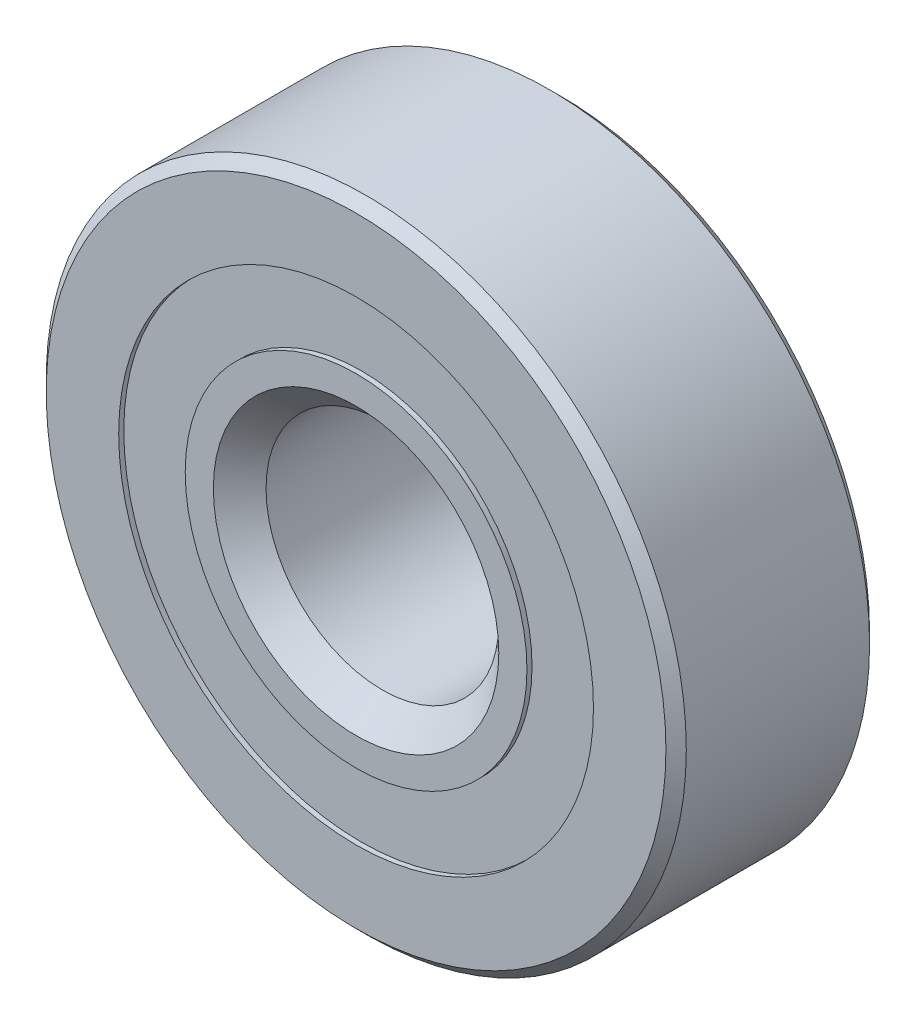
ISO-10303-21;
HEADER;
FILE_DESCRIPTION(('STEP AP214'),'2;1');
FILE_NAME('part.step','',(''),(''),'','','');
FILE_SCHEMA(('AUTOMOTIVE_DESIGN { 1 0 10303 214 1 1 1 1 }'));
ENDSEC;
DATA;
#1=APPLICATION_CONTEXT('core data for automotive mechanical design processes');
#2=APPLICATION_PROTOCOL_DEFINITION('international standard','automotive_design',2000,#1);
#3=PRODUCT_CONTEXT('',#1,'mechanical');
#4=PRODUCT('Part','Part','',(#3));
#5=PRODUCT_RELATED_PRODUCT_CATEGORY('part','',(#4));
#6=PRODUCT_DEFINITION_FORMATION('','',#4);
#7=PRODUCT_DEFINITION_CONTEXT('part definition',#1,'design');
#8=PRODUCT_DEFINITION('design','',#6,#7);
#9=PRODUCT_DEFINITION_SHAPE('','',#8);
#10=(LENGTH_UNIT() NAMED_UNIT(*) SI_UNIT(.MILLI.,.METRE.));
#11=(NAMED_UNIT(*) PLANE_ANGLE_UNIT() SI_UNIT($,.RADIAN.));
#12=(NAMED_UNIT(*) SI_UNIT($,.STERADIAN.) SOLID_ANGLE_UNIT());
#13=UNCERTAINTY_MEASURE_WITH_UNIT(LENGTH_MEASURE(1.E-05),#10,'distance_accuracy_value','');
#14=(GEOMETRIC_REPRESENTATION_CONTEXT(3) GLOBAL_UNCERTAINTY_ASSIGNED_CONTEXT((#13)) GLOBAL_UNIT_ASSIGNED_CONTEXT((#10,
#11,#12)) REPRESENTATION_CONTEXT('',''));
#15=CARTESIAN_POINT('',(0.,0.,0.));
#16=DIRECTION('',(0.,0.,1.));
#17=DIRECTION('',(1.,0.,0.));
#18=AXIS2_PLACEMENT_3D('',#15,#16,#17);
#19=CARTESIAN_POINT('',(0.,12.9529532967033,-5.2784375));
#20=DIRECTION('',(0.,0.,1.));
#21=DIRECTION('',(1.,0.,0.));
#22=AXIS2_PLACEMENT_3D('',#19,#20,#21);
#23=PLANE('',#22);
#24=CARTESIAN_POINT('',(0.,0.,-5.2784375));
#25=DIRECTION('',(0.,0.,1.));
#26=DIRECTION('',(1.,0.,0.));
#27=AXIS2_PLACEMENT_3D('',#24,#25,#26);
#28=CIRCLE('',#27,12.9529532967033);
#29=CARTESIAN_POINT('',(12.9529532967033,0.,-5.2784375));
#30=VERTEX_POINT('',#29);
#31=EDGE_CURVE('E57',#30,#30,#28,.T.);
#32=ORIENTED_EDGE('',*,*,#31,.F.);
#33=EDGE_LOOP('',(#32));
#34=FACE_BOUND('',#33,.T.);
#35=CARTESIAN_POINT('',(0.,0.,-5.2784375));
#36=DIRECTION('',(0.,0.,1.));
#37=DIRECTION('',(1.,0.,0.));
#38=AXIS2_PLACEMENT_3D('',#35,#36,#37);
#39=CIRCLE('',#38,9.32330697197914);
#40=CARTESIAN_POINT('',(9.32330697197914,0.,-5.2784375));
#41=VERTEX_POINT('',#40);
#42=EDGE_CURVE('E11',#41,#41,#39,.T.);
#43=ORIENTED_EDGE('',*,*,#42,.T.);
#44=EDGE_LOOP('',(#43));
#45=FACE_BOUND('',#44,.T.);
#46=ADVANCED_FACE('F43',(#34,#45),#23,.F.);
#47=CARTESIAN_POINT('',(0.,0.,5.55625));
#48=DIRECTION('',(0.,0.,1.));
#49=DIRECTION('',(1.,0.,0.));
#50=AXIS2_PLACEMENT_3D('',#47,#48,#49);
#51=CYLINDRICAL_SURFACE('',#50,9.32330697197914);
#52=ORIENTED_EDGE('',*,*,#42,.F.);
#53=EDGE_LOOP('',(#52));
#54=FACE_BOUND('',#53,.T.);
#55=CARTESIAN_POINT('',(0.,0.,-2.68211551867683));
#56=DIRECTION('',(0.,0.,1.));
#57=DIRECTION('',(1.,0.,0.));
#58=AXIS2_PLACEMENT_3D('',#55,#56,#57);
#59=CIRCLE('',#58,9.32330697197914);
#60=CARTESIAN_POINT('',(9.32330697197914,0.,-2.68211551867683));
#61=VERTEX_POINT('',#60);
#62=EDGE_CURVE('E49',#61,#61,#59,.T.);
#63=ORIENTED_EDGE('',*,*,#62,.T.);
#64=EDGE_LOOP('',(#63));
#65=FACE_BOUND('',#64,.T.);
#66=ADVANCED_FACE('F66',(#54,#65),#51,.F.);
#67=CARTESIAN_POINT('',(0.,12.9529532967033,-2.68211551867683));
#68=DIRECTION('',(0.,0.,-1.));
#69=DIRECTION('',(-1.,0.,0.));
#70=AXIS2_PLACEMENT_3D('',#67,#68,#69);
#71=PLANE('',#70);
#72=ORIENTED_EDGE('',*,*,#62,.F.);
#73=EDGE_LOOP('',(#72));
#74=FACE_BOUND('',#73,.T.);
#75=CARTESIAN_POINT('',(0.,0.,-2.68211551867683));
#76=DIRECTION('',(0.,0.,1.));
#77=DIRECTION('',(1.,0.,0.));
#78=AXIS2_PLACEMENT_3D('',#75,#76,#77);
#79=CIRCLE('',#78,12.9529532967033);
#80=CARTESIAN_POINT('',(12.9529532967033,0.,-2.68211551867683));
#81=VERTEX_POINT('',#80);
#82=EDGE_CURVE('E53',#81,#81,#79,.T.);
#83=ORIENTED_EDGE('',*,*,#82,.T.);
#84=EDGE_LOOP('',(#83));
#85=FACE_BOUND('',#84,.T.);
#86=ADVANCED_FACE('F70',(#74,#85),#71,.F.);
#87=CARTESIAN_POINT('',(0.,0.,5.55625));
#88=DIRECTION('',(0.,0.,1.));
#89=DIRECTION('',(1.,0.,0.));
#90=AXIS2_PLACEMENT_3D('',#87,#88,#89);
#91=CYLINDRICAL_SURFACE('',#90,12.9529532967033);
#92=ORIENTED_EDGE('',*,*,#82,.F.);
#93=EDGE_LOOP('',(#92));
#94=FACE_BOUND('',#93,.T.);
#95=ORIENTED_EDGE('',*,*,#31,.T.);
#96=EDGE_LOOP('',(#95));
#97=FACE_BOUND('',#96,.T.);
#98=ADVANCED_FACE('F63',(#94,#97),#91,.T.);
#99=CLOSED_SHELL('',(#46,#66,#86,#98));
#100=MANIFOLD_SOLID_BREP('B2',#99);
#101=CARTESIAN_POINT('',(0.,12.9529532967033,5.2784375));
#102=DIRECTION('',(0.,0.,-1.));
#103=DIRECTION('',(-1.,0.,0.));
#104=AXIS2_PLACEMENT_3D('',#101,#102,#103);
#105=PLANE('',#104);
#106=CARTESIAN_POINT('',(0.,0.,5.2784375));
#107=DIRECTION('',(0.,0.,1.));
#108=DIRECTION('',(1.,0.,0.));
#109=AXIS2_PLACEMENT_3D('',#106,#107,#108);
#110=CIRCLE('',#109,9.32330697197914);
#111=CARTESIAN_POINT('',(9.32330697197914,0.,5.2784375));
#112=VERTEX_POINT('',#111);
#113=EDGE_CURVE('E42',#112,#112,#110,.T.);
#114=ORIENTED_EDGE('',*,*,#113,.F.);
#115=EDGE_LOOP('',(#114));
#116=FACE_BOUND('',#115,.T.);
#117=CARTESIAN_POINT('',(0.,0.,5.2784375));
#118=DIRECTION('',(0.,0.,1.));
#119=DIRECTION('',(1.,0.,0.));
#120=AXIS2_PLACEMENT_3D('',#117,#118,#119);
#121=CIRCLE('',#120,12.9529532967033);
#122=CARTESIAN_POINT('',(12.9529532967033,0.,5.2784375));
#123=VERTEX_POINT('',#122);
#124=EDGE_CURVE('E125',#123,#123,#121,.T.);
#125=ORIENTED_EDGE('',*,*,#124,.T.);
#126=EDGE_LOOP('',(#125));
#127=FACE_BOUND('',#126,.T.);
#128=ADVANCED_FACE('F111',(#116,#127),#105,.F.);
#129=CARTESIAN_POINT('',(0.,0.,5.55625));
#130=DIRECTION('',(0.,0.,1.));
#131=DIRECTION('',(1.,0.,0.));
#132=AXIS2_PLACEMENT_3D('',#129,#130,#131);
#133=CYLINDRICAL_SURFACE('',#132,9.32330697197914);
#134=CARTESIAN_POINT('',(0.,0.,2.68211551867683));
#135=DIRECTION('',(0.,0.,1.));
#136=DIRECTION('',(1.,0.,0.));
#137=AXIS2_PLACEMENT_3D('',#134,#135,#136);
#138=CIRCLE('',#137,9.32330697197914);
#139=CARTESIAN_POINT('',(9.32330697197914,0.,2.68211551867683));
#140=VERTEX_POINT('',#139);
#141=EDGE_CURVE('E117',#140,#140,#138,.T.);
#142=ORIENTED_EDGE('',*,*,#141,.F.);
#143=EDGE_LOOP('',(#142));
#144=FACE_BOUND('',#143,.T.);
#145=ORIENTED_EDGE('',*,*,#113,.T.);
#146=EDGE_LOOP('',(#145));
#147=FACE_BOUND('',#146,.T.);
#148=ADVANCED_FACE('F140',(#144,#147),#133,.F.);
#149=CARTESIAN_POINT('',(0.,12.9529532967033,2.68211551867683));
#150=DIRECTION('',(0.,0.,1.));
#151=DIRECTION('',(1.,0.,0.));
#152=AXIS2_PLACEMENT_3D('',#149,#150,#151);
#153=PLANE('',#152);
#154=CARTESIAN_POINT('',(0.,0.,2.68211551867683));
#155=DIRECTION('',(0.,0.,1.));
#156=DIRECTION('',(1.,0.,0.));
#157=AXIS2_PLACEMENT_3D('',#154,#155,#156);
#158=CIRCLE('',#157,12.9529532967033);
#159=CARTESIAN_POINT('',(12.9529532967033,0.,2.68211551867683));
#160=VERTEX_POINT('',#159);
#161=EDGE_CURVE('E121',#160,#160,#158,.T.);
#162=ORIENTED_EDGE('',*,*,#161,.F.);
#163=EDGE_LOOP('',(#162));
#164=FACE_BOUND('',#163,.T.);
#165=ORIENTED_EDGE('',*,*,#141,.T.);
#166=EDGE_LOOP('',(#165));
#167=FACE_BOUND('',#166,.T.);
#168=ADVANCED_FACE('F135',(#164,#167),#153,.F.);
#169=CARTESIAN_POINT('',(0.,0.,5.55625));
#170=DIRECTION('',(0.,0.,1.));
#171=DIRECTION('',(1.,0.,0.));
#172=AXIS2_PLACEMENT_3D('',#169,#170,#171);
#173=CYLINDRICAL_SURFACE('',#172,12.9529532967033);
#174=ORIENTED_EDGE('',*,*,#124,.F.);
#175=EDGE_LOOP('',(#174));
#176=FACE_BOUND('',#175,.T.);
#177=ORIENTED_EDGE('',*,*,#161,.T.);
#178=EDGE_LOOP('',(#177));
#179=FACE_BOUND('',#178,.T.);
#180=ADVANCED_FACE('F132',(#176,#179),#173,.T.);
#181=CLOSED_SHELL('',(#128,#148,#168,#180));
#182=MANIFOLD_SOLID_BREP('B6',#181);
#183=CARTESIAN_POINT('',(-5.95312499999987,10.3111149638085,0.));
#184=DIRECTION('',(0.,0.,1.));
#185=DIRECTION('',(-0.499999999999989,0.866025403784445,0.));
#186=AXIS2_PLACEMENT_3D('',#183,#184,#185);
#187=SPHERICAL_SURFACE('',#186,2.68211551867683);
#188=CARTESIAN_POINT('',(-5.95312499999987,10.3111149638085,2.68211551867683));
#189=VERTEX_POINT('',#188);
#190=VERTEX_LOOP('',#189);
#191=FACE_BOUND('',#190,.T.);
#192=ADVANCED_FACE('F195',(#191),#187,.T.);
#193=CLOSED_SHELL('',(#192));
#194=MANIFOLD_SOLID_BREP('B37',#193);
#195=CARTESIAN_POINT('',(-10.3111149638084,5.95312500000012,0.));
#196=DIRECTION('',(0.,0.,1.));
#197=DIRECTION('',(-0.866025403784433,0.50000000000001,0.));
#198=AXIS2_PLACEMENT_3D('',#195,#196,#197);
#199=SPHERICAL_SURFACE('',#198,2.68211551867683);
#200=CARTESIAN_POINT('',(-10.3111149638084,5.95312500000012,2.68211551867683));
#201=VERTEX_POINT('',#200);
#202=VERTEX_LOOP('',#201);
#203=FACE_BOUND('',#202,.T.);
#204=ADVANCED_FACE('F227',(#203),#199,.T.);
#205=CLOSED_SHELL('',(#204));
#206=MANIFOLD_SOLID_BREP('B107',#205);
#207=CARTESIAN_POINT('',(-11.90625,1.24711349071803E-13,0.));
#208=DIRECTION('',(0.,0.,1.));
#209=DIRECTION('',(-1.,0.,0.));
#210=AXIS2_PLACEMENT_3D('',#207,#208,#209);
#211=SPHERICAL_SURFACE('',#210,2.68211551867683);
#212=CARTESIAN_POINT('',(-11.90625,1.24711349071803E-13,2.68211551867683));
#213=VERTEX_POINT('',#212);
#214=VERTEX_LOOP('',#213);
#215=FACE_BOUND('',#214,.T.);
#216=ADVANCED_FACE('F256',(#215),#211,.T.);
#217=CLOSED_SHELL('',(#216));
#218=MANIFOLD_SOLID_BREP('B191',#217);
#219=CARTESIAN_POINT('',(-10.3111149638085,-5.9531249999999,0.));
#220=DIRECTION('',(0.,0.,1.));
#221=DIRECTION('',(-0.866025403784443,-0.499999999999992,0.));
#222=AXIS2_PLACEMENT_3D('',#219,#220,#221);
#223=SPHERICAL_SURFACE('',#222,2.68211551867683);
#224=CARTESIAN_POINT('',(-10.3111149638085,-5.9531249999999,2.68211551867683));
#225=VERTEX_POINT('',#224);
#226=VERTEX_LOOP('',#225);
#227=FACE_BOUND('',#226,.T.);
#228=ADVANCED_FACE('F287',(#227),#223,.T.);
#229=CLOSED_SHELL('',(#228));
#230=MANIFOLD_SOLID_BREP('B223',#229);
#231=CARTESIAN_POINT('',(-5.95312500000009,-10.3111149638084,0.));
#232=DIRECTION('',(0.,0.,1.));
#233=DIRECTION('',(-0.500000000000007,-0.866025403784435,0.));
#234=AXIS2_PLACEMENT_3D('',#231,#232,#233);
#235=SPHERICAL_SURFACE('',#234,2.68211551867683);
#236=CARTESIAN_POINT('',(-5.95312500000009,-10.3111149638084,2.68211551867683));
#237=VERTEX_POINT('',#236);
#238=VERTEX_LOOP('',#237);
#239=FACE_BOUND('',#238,.T.);
#240=ADVANCED_FACE('F318',(#239),#235,.T.);
#241=CLOSED_SHELL('',(#240));
#242=MANIFOLD_SOLID_BREP('B252',#241);
#243=CARTESIAN_POINT('',(0.,-11.90625,0.));
#244=DIRECTION('',(0.,0.,1.));
#245=DIRECTION('',(0.,-1.,0.));
#246=AXIS2_PLACEMENT_3D('',#243,#244,#245);
#247=SPHERICAL_SURFACE('',#246,2.68211551867683);
#248=CARTESIAN_POINT('',(0.,-11.90625,2.68211551867683));
#249=VERTEX_POINT('',#248);
#250=VERTEX_LOOP('',#249);
#251=FACE_BOUND('',#250,.T.);
#252=ADVANCED_FACE('F349',(#251),#247,.T.);
#253=CLOSED_SHELL('',(#252));
#254=MANIFOLD_SOLID_BREP('B283',#253);
#255=CARTESIAN_POINT('',(5.95312499999994,-10.3111149638085,0.));
#256=DIRECTION('',(0.,0.,1.));
#257=DIRECTION('',(0.499999999999995,-0.866025403784442,0.));
#258=AXIS2_PLACEMENT_3D('',#255,#256,#257);
#259=SPHERICAL_SURFACE('',#258,2.68211551867683);
#260=CARTESIAN_POINT('',(5.95312499999994,-10.3111149638085,2.68211551867683));
#261=VERTEX_POINT('',#260);
#262=VERTEX_LOOP('',#261);
#263=FACE_BOUND('',#262,.T.);
#264=ADVANCED_FACE('F380',(#263),#259,.T.);
#265=CLOSED_SHELL('',(#264));
#266=MANIFOLD_SOLID_BREP('B314',#265);
#267=CARTESIAN_POINT('',(10.3111149638084,-5.95312500000005,0.));
#268=DIRECTION('',(0.,0.,1.));
#269=DIRECTION('',(0.866025403784436,-0.500000000000004,0.));
#270=AXIS2_PLACEMENT_3D('',#267,#268,#269);
#271=SPHERICAL_SURFACE('',#270,2.68211551867683);
#272=CARTESIAN_POINT('',(10.3111149638084,-5.95312500000005,2.68211551867683));
#273=VERTEX_POINT('',#272);
#274=VERTEX_LOOP('',#273);
#275=FACE_BOUND('',#274,.T.);
#276=ADVANCED_FACE('F411',(#275),#271,.T.);
#277=CLOSED_SHELL('',(#276));
#278=MANIFOLD_SOLID_BREP('B345',#277);
#279=CARTESIAN_POINT('',(11.90625,0.,0.));
#280=DIRECTION('',(0.,0.,1.));
#281=DIRECTION('',(1.,0.,0.));
#282=AXIS2_PLACEMENT_3D('',#279,#280,#281);
#283=SPHERICAL_SURFACE('',#282,2.68211551867683);
#284=CARTESIAN_POINT('',(11.90625,0.,2.68211551867683));
#285=VERTEX_POINT('',#284);
#286=VERTEX_LOOP('',#285);
#287=FACE_BOUND('',#286,.T.);
#288=ADVANCED_FACE('F442',(#287),#283,.T.);
#289=CLOSED_SHELL('',(#288));
#290=MANIFOLD_SOLID_BREP('B376',#289);
#291=CARTESIAN_POINT('',(10.3111149638085,5.95312499999998,0.));
#292=DIRECTION('',(0.,0.,1.));
#293=DIRECTION('',(0.86602540378444,0.499999999999998,0.));
#294=AXIS2_PLACEMENT_3D('',#291,#292,#293);
#295=SPHERICAL_SURFACE('',#294,2.68211551867683);
#296=CARTESIAN_POINT('',(10.3111149638085,5.95312499999998,2.68211551867683));
#297=VERTEX_POINT('',#296);
#298=VERTEX_LOOP('',#297);
#299=FACE_BOUND('',#298,.T.);
#300=ADVANCED_FACE('F473',(#299),#295,.T.);
#301=CLOSED_SHELL('',(#300));
#302=MANIFOLD_SOLID_BREP('B407',#301);
#303=CARTESIAN_POINT('',(5.95312500000001,10.3111149638085,0.));
#304=DIRECTION('',(0.,0.,1.));
#305=DIRECTION('',(0.500000000000001,0.866025403784438,0.));
#306=AXIS2_PLACEMENT_3D('',#303,#304,#305);
#307=SPHERICAL_SURFACE('',#306,2.68211551867683);
#308=CARTESIAN_POINT('',(5.95312500000001,10.3111149638085,2.68211551867683));
#309=VERTEX_POINT('',#308);
#310=VERTEX_LOOP('',#309);
#311=FACE_BOUND('',#310,.T.);
#312=ADVANCED_FACE('F505',(#311),#307,.T.);
#313=CLOSED_SHELL('',(#312));
#314=MANIFOLD_SOLID_BREP('B438',#313);
#315=CARTESIAN_POINT('',(0.,11.90625,0.));
#316=DIRECTION('',(0.,0.,1.));
#317=DIRECTION('',(0.,1.,0.));
#318=AXIS2_PLACEMENT_3D('',#315,#316,#317);
#319=SPHERICAL_SURFACE('',#318,2.68211551867683);
#320=CARTESIAN_POINT('',(0.,11.90625,2.68211551867683));
#321=VERTEX_POINT('',#320);
#322=VERTEX_LOOP('',#321);
#323=FACE_BOUND('',#322,.T.);
#324=ADVANCED_FACE('F541',(#323),#319,.T.);
#325=CLOSED_SHELL('',(#324));
#326=MANIFOLD_SOLID_BREP('B469',#325);
#327=CARTESIAN_POINT('',(0.,0.,5.55625));
#328=DIRECTION('',(0.,0.,1.));
#329=DIRECTION('',(1.,0.,0.));
#330=AXIS2_PLACEMENT_3D('',#327,#328,#329);
#331=CYLINDRICAL_SURFACE('',#330,9.32330697197914);
#332=CARTESIAN_POINT('',(0.,0.,5.55625));
#333=DIRECTION('',(0.,0.,1.));
#334=DIRECTION('',(1.,0.,0.));
#335=AXIS2_PLACEMENT_3D('',#332,#333,#334);
#336=CIRCLE('',#335,9.32330697197914);
#337=CARTESIAN_POINT('',(9.32330697197914,0.,5.55625));
#338=VERTEX_POINT('',#337);
#339=EDGE_CURVE('E601',#338,#338,#336,.T.);
#340=ORIENTED_EDGE('',*,*,#339,.F.);
#341=EDGE_LOOP('',(#340));
#342=FACE_BOUND('',#341,.T.);
#343=CARTESIAN_POINT('',(0.,0.,5.2784375));
#344=DIRECTION('',(0.,0.,1.));
#345=DIRECTION('',(1.,0.,0.));
#346=AXIS2_PLACEMENT_3D('',#343,#344,#345);
#347=CIRCLE('',#346,9.32330697197914);
#348=CARTESIAN_POINT('',(9.32330697197914,0.,5.2784375));
#349=VERTEX_POINT('',#348);
#350=EDGE_CURVE('E540',#349,#349,#347,.T.);
#351=ORIENTED_EDGE('',*,*,#350,.T.);
#352=EDGE_LOOP('',(#351));
#353=FACE_BOUND('',#352,.T.);
#354=ADVANCED_FACE('F561',(#342,#353),#331,.T.);
#355=CARTESIAN_POINT('',(0.,9.32330697197914,5.2784375));
#356=DIRECTION('',(0.,0.,1.));
#357=DIRECTION('',(1.,0.,0.));
#358=AXIS2_PLACEMENT_3D('',#355,#356,#357);
#359=PLANE('',#358);
#360=ORIENTED_EDGE('',*,*,#350,.F.);
#361=EDGE_LOOP('',(#360));
#362=FACE_BOUND('',#361,.T.);
#363=CARTESIAN_POINT('',(0.,0.,5.2784375));
#364=DIRECTION('',(0.,0.,1.));
#365=DIRECTION('',(1.,0.,0.));
#366=AXIS2_PLACEMENT_3D('',#363,#364,#365);
#367=CIRCLE('',#366,9.04549447197914);
#368=CARTESIAN_POINT('',(9.04549447197914,0.,5.2784375));
#369=VERTEX_POINT('',#368);
#370=EDGE_CURVE('E567',#369,#369,#367,.T.);
#371=ORIENTED_EDGE('',*,*,#370,.T.);
#372=EDGE_LOOP('',(#371));
#373=FACE_BOUND('',#372,.T.);
#374=ADVANCED_FACE('F608',(#362,#373),#359,.F.);
#375=CARTESIAN_POINT('',(0.,0.,4.02001026868245));
#376=DIRECTION('',(0.,0.,1.));
#377=DIRECTION('',(1.,0.,0.));
#378=AXIS2_PLACEMENT_3D('',#375,#376,#377);
#379=CONICAL_SURFACE('',#378,7.78706724066159,0.78539816339745);
#380=ORIENTED_EDGE('',*,*,#370,.F.);
#381=EDGE_LOOP('',(#380));
#382=FACE_BOUND('',#381,.T.);
#383=CARTESIAN_POINT('',(0.,0.,4.02001026868245));
#384=DIRECTION('',(0.,0.,1.));
#385=DIRECTION('',(1.,0.,0.));
#386=AXIS2_PLACEMENT_3D('',#383,#384,#385);
#387=CIRCLE('',#386,7.78706724066159);
#388=CARTESIAN_POINT('',(7.78706724066159,0.,4.02001026868245));
#389=VERTEX_POINT('',#388);
#390=EDGE_CURVE('E571',#389,#389,#387,.T.);
#391=ORIENTED_EDGE('',*,*,#390,.T.);
#392=EDGE_LOOP('',(#391));
#393=FACE_BOUND('',#392,.T.);
#394=ADVANCED_FACE('F612',(#382,#393),#379,.T.);
#395=CARTESIAN_POINT('',(0.,0.,5.55625));
#396=DIRECTION('',(0.,0.,1.));
#397=DIRECTION('',(1.,0.,0.));
#398=AXIS2_PLACEMENT_3D('',#395,#396,#397);
#399=CYLINDRICAL_SURFACE('',#398,7.78706724066159);
#400=ORIENTED_EDGE('',*,*,#390,.F.);
#401=EDGE_LOOP('',(#400));
#402=FACE_BOUND('',#401,.T.);
#403=CARTESIAN_POINT('',(0.,0.,0.));
#404=DIRECTION('',(0.,0.,1.));
#405=DIRECTION('',(1.,0.,0.));
#406=AXIS2_PLACEMENT_3D('',#403,#404,#405);
#407=CIRCLE('',#406,7.78706724066159);
#408=CARTESIAN_POINT('',(7.78706724066159,0.,0.));
#409=VERTEX_POINT('',#408);
#410=EDGE_CURVE('E575',#409,#409,#407,.T.);
#411=ORIENTED_EDGE('',*,*,#410,.T.);
#412=EDGE_LOOP('',(#411));
#413=FACE_BOUND('',#412,.T.);
#414=ADVANCED_FACE('F617',(#402,#413),#399,.T.);
#415=CARTESIAN_POINT('',(0.,7.78706724066159,0.));
#416=DIRECTION('',(0.,0.,-1.));
#417=DIRECTION('',(-1.,0.,0.));
#418=AXIS2_PLACEMENT_3D('',#415,#416,#417);
#419=PLANE('',#418);
#420=ORIENTED_EDGE('',*,*,#410,.F.);
#421=EDGE_LOOP('',(#420));
#422=FACE_BOUND('',#421,.T.);
#423=CARTESIAN_POINT('',(0.,0.,0.));
#424=DIRECTION('',(0.,0.,1.));
#425=DIRECTION('',(1.,0.,0.));
#426=AXIS2_PLACEMENT_3D('',#423,#424,#425);
#427=CIRCLE('',#426,9.22413448132317);
#428=CARTESIAN_POINT('',(9.22413448132317,0.,0.));
#429=VERTEX_POINT('',#428);
#430=EDGE_CURVE('E580',#429,#429,#427,.T.);
#431=ORIENTED_EDGE('',*,*,#430,.T.);
#432=EDGE_LOOP('',(#431));
#433=FACE_BOUND('',#432,.T.);
#434=ADVANCED_FACE('F623',(#422,#433),#419,.F.);
#435=CARTESIAN_POINT('',(0.,0.,0.));
#436=DIRECTION('',(0.,0.,1.));
#437=DIRECTION('',(1.,0.,0.));
#438=AXIS2_PLACEMENT_3D('',#435,#436,#437);
#439=TOROIDAL_SURFACE('',#438,11.90625,2.68211551867683);
#440=ORIENTED_EDGE('',*,*,#430,.F.);
#441=EDGE_LOOP('',(#440));
#442=FACE_BOUND('',#441,.T.);
#443=CARTESIAN_POINT('',(0.,0.,-2.46944444444444));
#444=DIRECTION('',(0.,0.,1.));
#445=DIRECTION('',(1.,0.,0.));
#446=AXIS2_PLACEMENT_3D('',#443,#444,#445);
#447=CIRCLE('',#446,10.8595467032967);
#448=CARTESIAN_POINT('',(10.8595467032967,0.,-2.46944444444444));
#449=VERTEX_POINT('',#448);
#450=EDGE_CURVE('E583',#449,#449,#447,.T.);
#451=ORIENTED_EDGE('',*,*,#450,.T.);
#452=EDGE_LOOP('',(#451));
#453=FACE_BOUND('',#452,.T.);
#454=ADVANCED_FACE('F627',(#442,#453),#439,.F.);
#455=CARTESIAN_POINT('',(0.,0.,5.55625));
#456=DIRECTION('',(0.,0.,1.));
#457=DIRECTION('',(1.,0.,0.));
#458=AXIS2_PLACEMENT_3D('',#455,#456,#457);
#459=CYLINDRICAL_SURFACE('',#458,10.8595467032967);
#460=ORIENTED_EDGE('',*,*,#450,.F.);
#461=EDGE_LOOP('',(#460));
#462=FACE_BOUND('',#461,.T.);
#463=CARTESIAN_POINT('',(0.,0.,-5.55625));
#464=DIRECTION('',(0.,0.,1.));
#465=DIRECTION('',(1.,0.,0.));
#466=AXIS2_PLACEMENT_3D('',#463,#464,#465);
#467=CIRCLE('',#466,10.8595467032967);
#468=CARTESIAN_POINT('',(10.8595467032967,0.,-5.55625));
#469=VERTEX_POINT('',#468);
#470=EDGE_CURVE('E586',#469,#469,#467,.T.);
#471=ORIENTED_EDGE('',*,*,#470,.T.);
#472=EDGE_LOOP('',(#471));
#473=FACE_BOUND('',#472,.T.);
#474=ADVANCED_FACE('F631',(#462,#473),#459,.T.);
#475=CARTESIAN_POINT('',(0.,6.905625,-5.55625));
#476=DIRECTION('',(0.,0.,1.));
#477=DIRECTION('',(1.,0.,0.));
#478=AXIS2_PLACEMENT_3D('',#475,#476,#477);
#479=PLANE('',#478);
#480=ORIENTED_EDGE('',*,*,#470,.F.);
#481=EDGE_LOOP('',(#480));
#482=FACE_BOUND('',#481,.T.);
#483=CARTESIAN_POINT('',(0.,0.,-5.55625));
#484=DIRECTION('',(0.,0.,1.));
#485=DIRECTION('',(1.,0.,0.));
#486=AXIS2_PLACEMENT_3D('',#483,#484,#485);
#487=CIRCLE('',#486,6.905625);
#488=CARTESIAN_POINT('',(6.905625,0.,-5.55625));
#489=VERTEX_POINT('',#488);
#490=EDGE_CURVE('E589',#489,#489,#487,.T.);
#491=ORIENTED_EDGE('',*,*,#490,.T.);
#492=EDGE_LOOP('',(#491));
#493=FACE_BOUND('',#492,.T.);
#494=ADVANCED_FACE('F635',(#482,#493),#479,.F.);
#495=CARTESIAN_POINT('',(0.,0.,-5.000625));
#496=DIRECTION('',(0.,0.,-1.));
#497=DIRECTION('',(-1.,0.,0.));
#498=AXIS2_PLACEMENT_3D('',#495,#496,#497);
#499=CONICAL_SURFACE('',#498,6.35,0.785398163397448);
#500=ORIENTED_EDGE('',*,*,#490,.F.);
#501=EDGE_LOOP('',(#500));
#502=FACE_BOUND('',#501,.T.);
#503=CARTESIAN_POINT('',(0.,0.,-5.000625));
#504=DIRECTION('',(0.,0.,1.));
#505=DIRECTION('',(1.,0.,0.));
#506=AXIS2_PLACEMENT_3D('',#503,#504,#505);
#507=CIRCLE('',#506,6.35);
#508=CARTESIAN_POINT('',(6.35,0.,-5.000625));
#509=VERTEX_POINT('',#508);
#510=EDGE_CURVE('E592',#509,#509,#507,.T.);
#511=ORIENTED_EDGE('',*,*,#510,.T.);
#512=EDGE_LOOP('',(#511));
#513=FACE_BOUND('',#512,.T.);
#514=ADVANCED_FACE('F639',(#502,#513),#499,.F.);
#515=CARTESIAN_POINT('',(0.,0.,5.55625));
#516=DIRECTION('',(0.,0.,1.));
#517=DIRECTION('',(1.,0.,0.));
#518=AXIS2_PLACEMENT_3D('',#515,#516,#517);
#519=CYLINDRICAL_SURFACE('',#518,6.35);
#520=ORIENTED_EDGE('',*,*,#510,.F.);
#521=EDGE_LOOP('',(#520));
#522=FACE_BOUND('',#521,.T.);
#523=CARTESIAN_POINT('',(0.,0.,4.11918275933842));
#524=DIRECTION('',(0.,0.,1.));
#525=DIRECTION('',(1.,0.,0.));
#526=AXIS2_PLACEMENT_3D('',#523,#524,#525);
#527=CIRCLE('',#526,6.35);
#528=CARTESIAN_POINT('',(6.35,0.,4.11918275933842));
#529=VERTEX_POINT('',#528);
#530=EDGE_CURVE('E595',#529,#529,#527,.T.);
#531=ORIENTED_EDGE('',*,*,#530,.T.);
#532=EDGE_LOOP('',(#531));
#533=FACE_BOUND('',#532,.T.);
#534=ADVANCED_FACE('F643',(#522,#533),#519,.F.);
#535=CARTESIAN_POINT('',(0.,0.,5.55625));
#536=DIRECTION('',(0.,0.,1.));
#537=DIRECTION('',(1.,0.,0.));
#538=AXIS2_PLACEMENT_3D('',#535,#536,#537);
#539=CONICAL_SURFACE('',#538,7.78706724066158,0.78539816339745);
#540=ORIENTED_EDGE('',*,*,#530,.F.);
#541=EDGE_LOOP('',(#540));
#542=FACE_BOUND('',#541,.T.);
#543=CARTESIAN_POINT('',(0.,0.,5.55625));
#544=DIRECTION('',(0.,0.,1.));
#545=DIRECTION('',(1.,0.,0.));
#546=AXIS2_PLACEMENT_3D('',#543,#544,#545);
#547=CIRCLE('',#546,7.78706724066158);
#548=CARTESIAN_POINT('',(7.78706724066158,0.,5.55625));
#549=VERTEX_POINT('',#548);
#550=EDGE_CURVE('E598',#549,#549,#547,.T.);
#551=ORIENTED_EDGE('',*,*,#550,.T.);
#552=EDGE_LOOP('',(#551));
#553=FACE_BOUND('',#552,.T.);
#554=ADVANCED_FACE('F647',(#542,#553),#539,.F.);
#555=CARTESIAN_POINT('',(0.,9.32330697197914,5.55625));
#556=DIRECTION('',(0.,0.,-1.));
#557=DIRECTION('',(-1.,0.,0.));
#558=AXIS2_PLACEMENT_3D('',#555,#556,#557);
#559=PLANE('',#558);
#560=ORIENTED_EDGE('',*,*,#550,.F.);
#561=EDGE_LOOP('',(#560));
#562=FACE_BOUND('',#561,.T.);
#563=ORIENTED_EDGE('',*,*,#339,.T.);
#564=EDGE_LOOP('',(#563));
#565=FACE_BOUND('',#564,.T.);
#566=ADVANCED_FACE('F605',(#562,#565),#559,.F.);
#567=CLOSED_SHELL('',(#354,#374,#394,#414,#434,#454,#474,#494,#514,#534,#554,#566));
#568=MANIFOLD_SOLID_BREP('B501',#567);
#569=CARTESIAN_POINT('',(0.,0.,5.000625));
#570=DIRECTION('',(0.,0.,-1.));
#571=DIRECTION('',(-1.,0.,0.));
#572=AXIS2_PLACEMENT_3D('',#569,#570,#571);
#573=CONICAL_SURFACE('',#572,17.4625,0.785398163397447);
#574=CARTESIAN_POINT('',(0.,0.,5.55625));
#575=DIRECTION('',(0.,0.,1.));
#576=DIRECTION('',(1.,0.,0.));
#577=AXIS2_PLACEMENT_3D('',#574,#575,#576);
#578=CIRCLE('',#577,16.906875);
#579=CARTESIAN_POINT('',(16.906875,0.,5.55625));
#580=VERTEX_POINT('',#579);
#581=EDGE_CURVE('E773',#580,#580,#578,.T.);
#582=ORIENTED_EDGE('',*,*,#581,.F.);
#583=EDGE_LOOP('',(#582));
#584=FACE_BOUND('',#583,.T.);
#585=CARTESIAN_POINT('',(0.,0.,5.000625));
#586=DIRECTION('',(0.,0.,1.));
#587=DIRECTION('',(1.,0.,0.));
#588=AXIS2_PLACEMENT_3D('',#585,#586,#587);
#589=CIRCLE('',#588,17.4625);
#590=CARTESIAN_POINT('',(17.4625,0.,5.000625));
#591=VERTEX_POINT('',#590);
#592=EDGE_CURVE('E560',#591,#591,#589,.T.);
#593=ORIENTED_EDGE('',*,*,#592,.T.);
#594=EDGE_LOOP('',(#593));
#595=FACE_BOUND('',#594,.T.);
#596=ADVANCED_FACE('F745',(#584,#595),#573,.T.);
#597=CARTESIAN_POINT('',(0.,0.,5.55625));
#598=DIRECTION('',(0.,0.,1.));
#599=DIRECTION('',(1.,0.,0.));
#600=AXIS2_PLACEMENT_3D('',#597,#598,#599);
#601=CYLINDRICAL_SURFACE('',#600,17.4625);
#602=ORIENTED_EDGE('',*,*,#592,.F.);
#603=EDGE_LOOP('',(#602));
#604=FACE_BOUND('',#603,.T.);
#605=CARTESIAN_POINT('',(0.,0.,-5.000625));
#606=DIRECTION('',(0.,0.,1.));
#607=DIRECTION('',(1.,0.,0.));
#608=AXIS2_PLACEMENT_3D('',#605,#606,#607);
#609=CIRCLE('',#608,17.4625);
#610=CARTESIAN_POINT('',(17.4625,0.,-5.000625));
#611=VERTEX_POINT('',#610);
#612=EDGE_CURVE('E751',#611,#611,#609,.T.);
#613=ORIENTED_EDGE('',*,*,#612,.T.);
#614=EDGE_LOOP('',(#613));
#615=FACE_BOUND('',#614,.T.);
#616=ADVANCED_FACE('F780',(#604,#615),#601,.T.);
#617=CARTESIAN_POINT('',(0.,0.,-5.55625));
#618=DIRECTION('',(0.,0.,1.));
#619=DIRECTION('',(1.,0.,0.));
#620=AXIS2_PLACEMENT_3D('',#617,#618,#619);
#621=CONICAL_SURFACE('',#620,16.906875,0.785398163397448);
#622=ORIENTED_EDGE('',*,*,#612,.F.);
#623=EDGE_LOOP('',(#622));
#624=FACE_BOUND('',#623,.T.);
#625=CARTESIAN_POINT('',(0.,0.,-5.55625));
#626=DIRECTION('',(0.,0.,1.));
#627=DIRECTION('',(1.,0.,0.));
#628=AXIS2_PLACEMENT_3D('',#625,#626,#627);
#629=CIRCLE('',#628,16.906875);
#630=CARTESIAN_POINT('',(16.906875,0.,-5.55625));
#631=VERTEX_POINT('',#630);
#632=EDGE_CURVE('E755',#631,#631,#629,.T.);
#633=ORIENTED_EDGE('',*,*,#632,.T.);
#634=EDGE_LOOP('',(#633));
#635=FACE_BOUND('',#634,.T.);
#636=ADVANCED_FACE('F784',(#624,#635),#621,.T.);
#637=CARTESIAN_POINT('',(0.,16.906875,-5.55625));
#638=DIRECTION('',(0.,0.,1.));
#639=DIRECTION('',(1.,0.,0.));
#640=AXIS2_PLACEMENT_3D('',#637,#638,#639);
#641=PLANE('',#640);
#642=ORIENTED_EDGE('',*,*,#632,.F.);
#643=EDGE_LOOP('',(#642));
#644=FACE_BOUND('',#643,.T.);
#645=CARTESIAN_POINT('',(0.,0.,-5.55625));
#646=DIRECTION('',(0.,0.,1.));
#647=DIRECTION('',(1.,0.,0.));
#648=AXIS2_PLACEMENT_3D('',#645,#646,#647);
#649=CIRCLE('',#648,12.9529532967033);
#650=CARTESIAN_POINT('',(12.9529532967033,0.,-5.55625));
#651=VERTEX_POINT('',#650);
#652=EDGE_CURVE('E759',#651,#651,#649,.T.);
#653=ORIENTED_EDGE('',*,*,#652,.T.);
#654=EDGE_LOOP('',(#653));
#655=FACE_BOUND('',#654,.T.);
#656=ADVANCED_FACE('F789',(#644,#655),#641,.F.);
#657=CARTESIAN_POINT('',(0.,0.,5.55625));
#658=DIRECTION('',(0.,0.,1.));
#659=DIRECTION('',(1.,0.,0.));
#660=AXIS2_PLACEMENT_3D('',#657,#658,#659);
#661=CYLINDRICAL_SURFACE('',#660,12.9529532967033);
#662=ORIENTED_EDGE('',*,*,#652,.F.);
#663=EDGE_LOOP('',(#662));
#664=FACE_BOUND('',#663,.T.);
#665=CARTESIAN_POINT('',(0.,0.,-2.46944444444444));
#666=DIRECTION('',(0.,0.,1.));
#667=DIRECTION('',(1.,0.,0.));
#668=AXIS2_PLACEMENT_3D('',#665,#666,#667);
#669=CIRCLE('',#668,12.9529532967033);
#670=CARTESIAN_POINT('',(12.9529532967033,0.,-2.46944444444444));
#671=VERTEX_POINT('',#670);
#672=EDGE_CURVE('E764',#671,#671,#669,.T.);
#673=ORIENTED_EDGE('',*,*,#672,.T.);
#674=EDGE_LOOP('',(#673));
#675=FACE_BOUND('',#674,.T.);
#676=ADVANCED_FACE('F795',(#664,#675),#661,.F.);
#677=CARTESIAN_POINT('',(0.,0.,0.));
#678=DIRECTION('',(0.,0.,1.));
#679=DIRECTION('',(1.,0.,0.));
#680=AXIS2_PLACEMENT_3D('',#677,#678,#679);
#681=TOROIDAL_SURFACE('',#680,11.90625,2.68211551867683);
#682=ORIENTED_EDGE('',*,*,#672,.F.);
#683=EDGE_LOOP('',(#682));
#684=FACE_BOUND('',#683,.T.);
#685=CARTESIAN_POINT('',(0.,0.,2.46944444444444));
#686=DIRECTION('',(0.,0.,1.));
#687=DIRECTION('',(1.,0.,0.));
#688=AXIS2_PLACEMENT_3D('',#685,#686,#687);
#689=CIRCLE('',#688,12.9529532967033);
#690=CARTESIAN_POINT('',(12.9529532967033,0.,2.46944444444444));
#691=VERTEX_POINT('',#690);
#692=EDGE_CURVE('E767',#691,#691,#689,.T.);
#693=ORIENTED_EDGE('',*,*,#692,.T.);
#694=EDGE_LOOP('',(#693));
#695=FACE_BOUND('',#694,.T.);
#696=ADVANCED_FACE('F799',(#684,#695),#681,.F.);
#697=CARTESIAN_POINT('',(0.,0.,5.55625));
#698=DIRECTION('',(0.,0.,1.));
#699=DIRECTION('',(1.,0.,0.));
#700=AXIS2_PLACEMENT_3D('',#697,#698,#699);
#701=CYLINDRICAL_SURFACE('',#700,12.9529532967033);
#702=ORIENTED_EDGE('',*,*,#692,.F.);
#703=EDGE_LOOP('',(#702));
#704=FACE_BOUND('',#703,.T.);
#705=CARTESIAN_POINT('',(0.,0.,5.55625));
#706=DIRECTION('',(0.,0.,1.));
#707=DIRECTION('',(1.,0.,0.));
#708=AXIS2_PLACEMENT_3D('',#705,#706,#707);
#709=CIRCLE('',#708,12.9529532967033);
#710=CARTESIAN_POINT('',(12.9529532967033,0.,5.55625));
#711=VERTEX_POINT('',#710);
#712=EDGE_CURVE('E770',#711,#711,#709,.T.);
#713=ORIENTED_EDGE('',*,*,#712,.T.);
#714=EDGE_LOOP('',(#713));
#715=FACE_BOUND('',#714,.T.);
#716=ADVANCED_FACE('F803',(#704,#715),#701,.F.);
#717=CARTESIAN_POINT('',(0.,16.906875,5.55625));
#718=DIRECTION('',(0.,0.,-1.));
#719=DIRECTION('',(-1.,0.,0.));
#720=AXIS2_PLACEMENT_3D('',#717,#718,#719);
#721=PLANE('',#720);
#722=ORIENTED_EDGE('',*,*,#712,.F.);
#723=EDGE_LOOP('',(#722));
#724=FACE_BOUND('',#723,.T.);
#725=ORIENTED_EDGE('',*,*,#581,.T.);
#726=EDGE_LOOP('',(#725));
#727=FACE_BOUND('',#726,.T.);
#728=ADVANCED_FACE('F777',(#724,#727),#721,.F.);
#729=CLOSED_SHELL('',(#596,#616,#636,#656,#676,#696,#716,#728));
#730=MANIFOLD_SOLID_BREP('B535',#729);
#731=ADVANCED_BREP_SHAPE_REPRESENTATION('',(#18,#100,#182,#194,#206,#218,#230,#242,#254,#266,
#278,#290,#302,#314,#326,#568,#730),#14);
#732=SHAPE_DEFINITION_REPRESENTATION(#9,#731);
ENDSEC;
END-ISO-10303-21;
